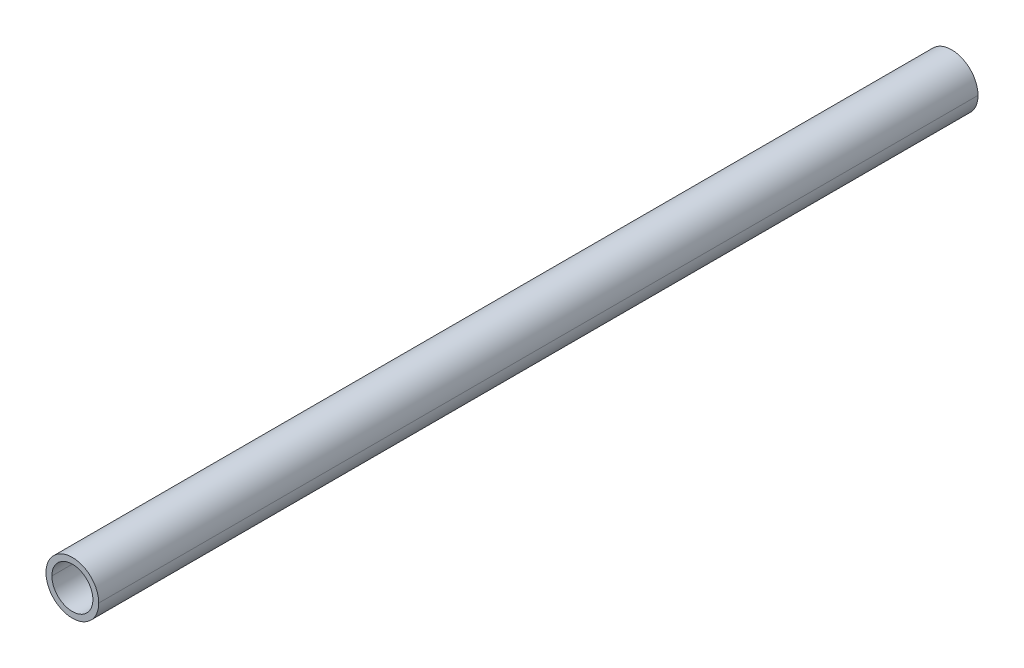
ISO-10303-21;
HEADER;
FILE_DESCRIPTION(('STEP AP214'),'2;1');
FILE_NAME('part.step','',(''),(''),'','','');
FILE_SCHEMA(('AUTOMOTIVE_DESIGN { 1 0 10303 214 1 1 1 1 }'));
ENDSEC;
DATA;
#1=APPLICATION_CONTEXT('core data for automotive mechanical design processes');
#2=APPLICATION_PROTOCOL_DEFINITION('international standard','automotive_design',2000,#1);
#3=PRODUCT_CONTEXT('',#1,'mechanical');
#4=PRODUCT('Part','Part','',(#3));
#5=PRODUCT_RELATED_PRODUCT_CATEGORY('part','',(#4));
#6=PRODUCT_DEFINITION_FORMATION('','',#4);
#7=PRODUCT_DEFINITION_CONTEXT('part definition',#1,'design');
#8=PRODUCT_DEFINITION('design','',#6,#7);
#9=PRODUCT_DEFINITION_SHAPE('','',#8);
#10=(LENGTH_UNIT() NAMED_UNIT(*) SI_UNIT(.MILLI.,.METRE.));
#11=(NAMED_UNIT(*) PLANE_ANGLE_UNIT() SI_UNIT($,.RADIAN.));
#12=(NAMED_UNIT(*) SI_UNIT($,.STERADIAN.) SOLID_ANGLE_UNIT());
#13=UNCERTAINTY_MEASURE_WITH_UNIT(LENGTH_MEASURE(1.E-05),#10,'distance_accuracy_value','');
#14=(GEOMETRIC_REPRESENTATION_CONTEXT(3) GLOBAL_UNCERTAINTY_ASSIGNED_CONTEXT((#13)) GLOBAL_UNIT_ASSIGNED_CONTEXT((#10,
#11,#12)) REPRESENTATION_CONTEXT('',''));
#15=CARTESIAN_POINT('',(0.,0.,0.));
#16=DIRECTION('',(0.,0.,1.));
#17=DIRECTION('',(1.,0.,0.));
#18=AXIS2_PLACEMENT_3D('',#15,#16,#17);
#19=CARTESIAN_POINT('',(0.,0.,300.06));
#20=DIRECTION('',(0.,0.,-1.));
#21=DIRECTION('',(-1.,0.,0.));
#22=AXIS2_PLACEMENT_3D('',#19,#20,#21);
#23=CYLINDRICAL_SURFACE('',#22,7.);
#24=DIRECTION('',(0.,0.,-1.));
#25=VECTOR('',#24,1.);
#26=CARTESIAN_POINT('',(7.,0.,300.06));
#27=LINE('',#26,#25);
#28=CARTESIAN_POINT('',(7.,0.,300.06));
#29=VERTEX_POINT('',#28);
#30=CARTESIAN_POINT('',(7.,0.,0.));
#31=VERTEX_POINT('',#30);
#32=EDGE_CURVE('E89',#29,#31,#27,.T.);
#33=ORIENTED_EDGE('',*,*,#32,.F.);
#34=CARTESIAN_POINT('',(0.,0.,300.06));
#35=DIRECTION('',(0.,0.,1.));
#36=DIRECTION('',(1.,0.,0.));
#37=AXIS2_PLACEMENT_3D('',#34,#35,#36);
#38=CIRCLE('',#37,7.);
#39=CARTESIAN_POINT('',(-7.,0.,300.06));
#40=VERTEX_POINT('',#39);
#41=EDGE_CURVE('E59',#29,#40,#38,.T.);
#42=ORIENTED_EDGE('',*,*,#41,.T.);
#43=DIRECTION('',(0.,0.,-1.));
#44=VECTOR('',#43,1.);
#45=CARTESIAN_POINT('',(-7.,0.,300.06));
#46=LINE('',#45,#44);
#47=CARTESIAN_POINT('',(-7.,0.,0.));
#48=VERTEX_POINT('',#47);
#49=EDGE_CURVE('E82',#40,#48,#46,.T.);
#50=ORIENTED_EDGE('',*,*,#49,.T.);
#51=CARTESIAN_POINT('',(0.,0.,0.));
#52=DIRECTION('',(0.,0.,1.));
#53=DIRECTION('',(1.,0.,0.));
#54=AXIS2_PLACEMENT_3D('',#51,#52,#53);
#55=CIRCLE('',#54,7.);
#56=EDGE_CURVE('E11',#31,#48,#55,.T.);
#57=ORIENTED_EDGE('',*,*,#56,.F.);
#58=EDGE_LOOP('',(#33,#42,#50,#57));
#59=FACE_BOUND('',#58,.T.);
#60=ADVANCED_FACE('F16',(#59),#23,.F.);
#61=CARTESIAN_POINT('',(0.,0.,300.06));
#62=DIRECTION('',(0.,0.,-1.));
#63=DIRECTION('',(-1.,0.,0.));
#64=AXIS2_PLACEMENT_3D('',#61,#62,#63);
#65=CYLINDRICAL_SURFACE('',#64,9.);
#66=DIRECTION('',(0.,0.,-1.));
#67=VECTOR('',#66,1.);
#68=CARTESIAN_POINT('',(9.,0.,300.06));
#69=LINE('',#68,#67);
#70=CARTESIAN_POINT('',(9.,0.,300.06));
#71=VERTEX_POINT('',#70);
#72=CARTESIAN_POINT('',(9.,0.,0.));
#73=VERTEX_POINT('',#72);
#74=EDGE_CURVE('E107',#71,#73,#69,.T.);
#75=ORIENTED_EDGE('',*,*,#74,.F.);
#76=CARTESIAN_POINT('',(0.,0.,300.06));
#77=DIRECTION('',(0.,0.,1.));
#78=DIRECTION('',(1.,0.,0.));
#79=AXIS2_PLACEMENT_3D('',#76,#77,#78);
#80=CIRCLE('',#79,9.);
#81=CARTESIAN_POINT('',(-9.,0.,300.06));
#82=VERTEX_POINT('',#81);
#83=EDGE_CURVE('E125',#82,#71,#80,.T.);
#84=ORIENTED_EDGE('',*,*,#83,.F.);
#85=DIRECTION('',(0.,0.,-1.));
#86=VECTOR('',#85,1.);
#87=CARTESIAN_POINT('',(-9.,0.,300.06));
#88=LINE('',#87,#86);
#89=CARTESIAN_POINT('',(-9.,0.,0.));
#90=VERTEX_POINT('',#89);
#91=EDGE_CURVE('E99',#82,#90,#88,.T.);
#92=ORIENTED_EDGE('',*,*,#91,.T.);
#93=CARTESIAN_POINT('',(0.,0.,0.));
#94=DIRECTION('',(0.,0.,1.));
#95=DIRECTION('',(1.,0.,0.));
#96=AXIS2_PLACEMENT_3D('',#93,#94,#95);
#97=CIRCLE('',#96,9.);
#98=EDGE_CURVE('E19',#90,#73,#97,.T.);
#99=ORIENTED_EDGE('',*,*,#98,.T.);
#100=EDGE_LOOP('',(#75,#84,#92,#99));
#101=FACE_BOUND('',#100,.T.);
#102=ADVANCED_FACE('F133',(#101),#65,.T.);
#103=CARTESIAN_POINT('',(0.,0.,0.));
#104=DIRECTION('',(0.,0.,1.));
#105=DIRECTION('',(1.,0.,0.));
#106=AXIS2_PLACEMENT_3D('',#103,#104,#105);
#107=PLANE('',#106);
#108=CARTESIAN_POINT('',(0.,0.,0.));
#109=DIRECTION('',(0.,0.,1.));
#110=DIRECTION('',(1.,0.,0.));
#111=AXIS2_PLACEMENT_3D('',#108,#109,#110);
#112=CIRCLE('',#111,7.);
#113=EDGE_CURVE('E80',#48,#31,#112,.T.);
#114=ORIENTED_EDGE('',*,*,#113,.T.);
#115=ORIENTED_EDGE('',*,*,#56,.T.);
#116=EDGE_LOOP('',(#114,#115));
#117=FACE_BOUND('',#116,.T.);
#118=ORIENTED_EDGE('',*,*,#98,.F.);
#119=CARTESIAN_POINT('',(0.,0.,0.));
#120=DIRECTION('',(0.,0.,1.));
#121=DIRECTION('',(1.,0.,0.));
#122=AXIS2_PLACEMENT_3D('',#119,#120,#121);
#123=CIRCLE('',#122,9.);
#124=EDGE_CURVE('E104',#73,#90,#123,.T.);
#125=ORIENTED_EDGE('',*,*,#124,.F.);
#126=EDGE_LOOP('',(#118,#125));
#127=FACE_BOUND('',#126,.T.);
#128=ADVANCED_FACE('F78',(#117,#127),#107,.F.);
#129=CARTESIAN_POINT('',(0.,0.,300.06));
#130=DIRECTION('',(0.,0.,1.));
#131=DIRECTION('',(1.,0.,0.));
#132=AXIS2_PLACEMENT_3D('',#129,#130,#131);
#133=PLANE('',#132);
#134=CARTESIAN_POINT('',(0.,0.,300.06));
#135=DIRECTION('',(0.,0.,1.));
#136=DIRECTION('',(1.,0.,0.));
#137=AXIS2_PLACEMENT_3D('',#134,#135,#136);
#138=CIRCLE('',#137,7.);
#139=EDGE_CURVE('E96',#40,#29,#138,.T.);
#140=ORIENTED_EDGE('',*,*,#139,.F.);
#141=ORIENTED_EDGE('',*,*,#41,.F.);
#142=EDGE_LOOP('',(#140,#141));
#143=FACE_BOUND('',#142,.T.);
#144=ORIENTED_EDGE('',*,*,#83,.T.);
#145=CARTESIAN_POINT('',(0.,0.,300.06));
#146=DIRECTION('',(0.,0.,1.));
#147=DIRECTION('',(1.,0.,0.));
#148=AXIS2_PLACEMENT_3D('',#145,#146,#147);
#149=CIRCLE('',#148,9.);
#150=EDGE_CURVE('E86',#71,#82,#149,.T.);
#151=ORIENTED_EDGE('',*,*,#150,.T.);
#152=EDGE_LOOP('',(#144,#151));
#153=FACE_BOUND('',#152,.T.);
#154=ADVANCED_FACE('F136',(#143,#153),#133,.T.);
#155=CARTESIAN_POINT('',(0.,0.,300.06));
#156=DIRECTION('',(0.,0.,-1.));
#157=DIRECTION('',(-1.,0.,0.));
#158=AXIS2_PLACEMENT_3D('',#155,#156,#157);
#159=CYLINDRICAL_SURFACE('',#158,9.);
#160=ORIENTED_EDGE('',*,*,#150,.F.);
#161=ORIENTED_EDGE('',*,*,#74,.T.);
#162=ORIENTED_EDGE('',*,*,#124,.T.);
#163=ORIENTED_EDGE('',*,*,#91,.F.);
#164=EDGE_LOOP('',(#160,#161,#162,#163));
#165=FACE_BOUND('',#164,.T.);
#166=ADVANCED_FACE('F134',(#165),#159,.T.);
#167=CARTESIAN_POINT('',(0.,0.,300.06));
#168=DIRECTION('',(0.,0.,-1.));
#169=DIRECTION('',(-1.,0.,0.));
#170=AXIS2_PLACEMENT_3D('',#167,#168,#169);
#171=CYLINDRICAL_SURFACE('',#170,7.);
#172=ORIENTED_EDGE('',*,*,#139,.T.);
#173=ORIENTED_EDGE('',*,*,#32,.T.);
#174=ORIENTED_EDGE('',*,*,#113,.F.);
#175=ORIENTED_EDGE('',*,*,#49,.F.);
#176=EDGE_LOOP('',(#172,#173,#174,#175));
#177=FACE_BOUND('',#176,.T.);
#178=ADVANCED_FACE('F88',(#177),#171,.F.);
#179=CLOSED_SHELL('',(#60,#102,#128,#154,#166,#178));
#180=MANIFOLD_SOLID_BREP('B1',#179);
#181=ADVANCED_BREP_SHAPE_REPRESENTATION('',(#18,#180),#14);
#182=SHAPE_DEFINITION_REPRESENTATION(#9,#181);
ENDSEC;
END-ISO-10303-21;
